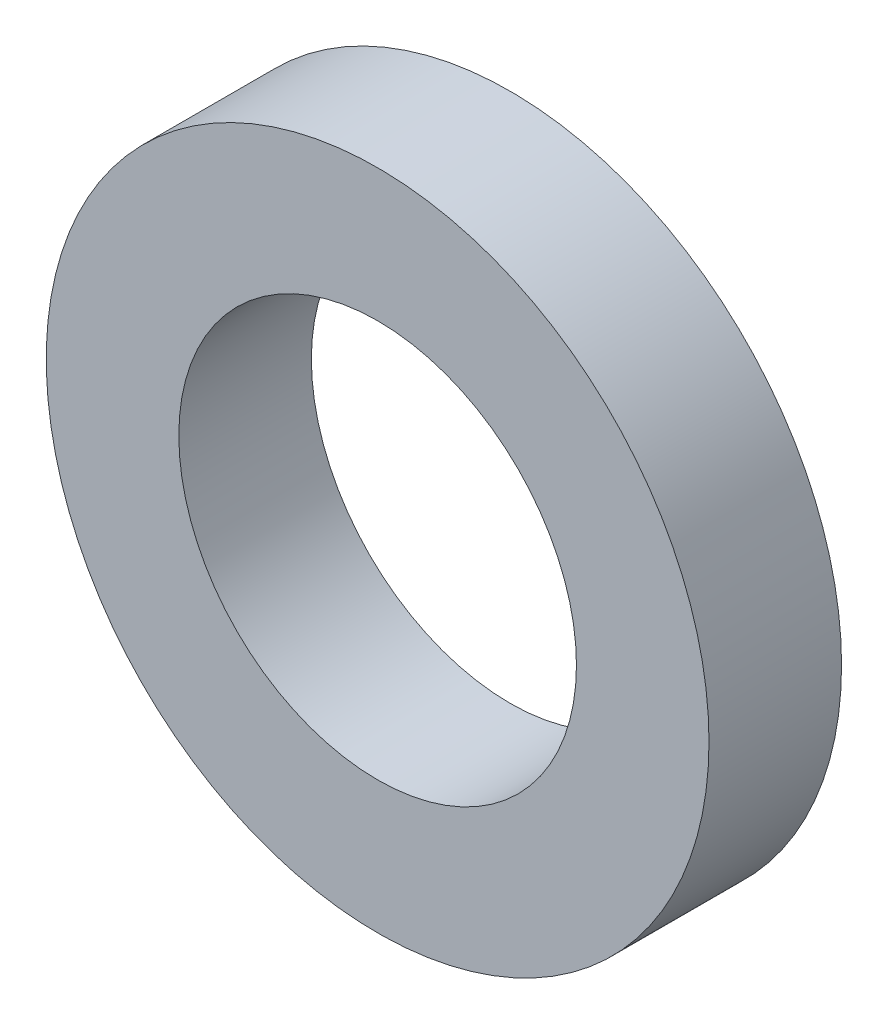
ISO-10303-21;
HEADER;
FILE_DESCRIPTION(('STEP AP214'),'2;1');
FILE_NAME('part.step','',(''),(''),'','','');
FILE_SCHEMA(('AUTOMOTIVE_DESIGN { 1 0 10303 214 1 1 1 1 }'));
ENDSEC;
DATA;
#1=APPLICATION_CONTEXT('core data for automotive mechanical design processes');
#2=APPLICATION_PROTOCOL_DEFINITION('international standard','automotive_design',2000,#1);
#3=PRODUCT_CONTEXT('',#1,'mechanical');
#4=PRODUCT('Part','Part','',(#3));
#5=PRODUCT_RELATED_PRODUCT_CATEGORY('part','',(#4));
#6=PRODUCT_DEFINITION_FORMATION('','',#4);
#7=PRODUCT_DEFINITION_CONTEXT('part definition',#1,'design');
#8=PRODUCT_DEFINITION('design','',#6,#7);
#9=PRODUCT_DEFINITION_SHAPE('','',#8);
#10=(LENGTH_UNIT() NAMED_UNIT(*) SI_UNIT(.MILLI.,.METRE.));
#11=(NAMED_UNIT(*) PLANE_ANGLE_UNIT() SI_UNIT($,.RADIAN.));
#12=(NAMED_UNIT(*) SI_UNIT($,.STERADIAN.) SOLID_ANGLE_UNIT());
#13=UNCERTAINTY_MEASURE_WITH_UNIT(LENGTH_MEASURE(1.E-05),#10,'distance_accuracy_value','');
#14=(GEOMETRIC_REPRESENTATION_CONTEXT(3) GLOBAL_UNCERTAINTY_ASSIGNED_CONTEXT((#13)) GLOBAL_UNIT_ASSIGNED_CONTEXT((#10,
#11,#12)) REPRESENTATION_CONTEXT('',''));
#15=CARTESIAN_POINT('',(0.,0.,0.));
#16=DIRECTION('',(0.,0.,1.));
#17=DIRECTION('',(1.,0.,0.));
#18=AXIS2_PLACEMENT_3D('',#15,#16,#17);
#19=CARTESIAN_POINT('',(0.,0.,10.));
#20=DIRECTION('',(0.,0.,1.));
#21=DIRECTION('',(1.,0.,0.));
#22=AXIS2_PLACEMENT_3D('',#19,#20,#21);
#23=PLANE('',#22);
#24=CARTESIAN_POINT('',(0.,0.,10.));
#25=DIRECTION('',(0.,0.,1.));
#26=DIRECTION('',(1.,0.,0.));
#27=AXIS2_PLACEMENT_3D('',#24,#25,#26);
#28=CIRCLE('',#27,25.);
#29=CARTESIAN_POINT('',(25.,0.,10.));
#30=VERTEX_POINT('',#29);
#31=EDGE_CURVE('E10',#30,#30,#28,.T.);
#32=ORIENTED_EDGE('',*,*,#31,.T.);
#33=EDGE_LOOP('',(#32));
#34=FACE_BOUND('',#33,.T.);
#35=CARTESIAN_POINT('',(0.,0.,10.));
#36=DIRECTION('',(0.,0.,1.));
#37=DIRECTION('',(1.,0.,0.));
#38=AXIS2_PLACEMENT_3D('',#35,#36,#37);
#39=CIRCLE('',#38,15.);
#40=CARTESIAN_POINT('',(15.,0.,10.));
#41=VERTEX_POINT('',#40);
#42=EDGE_CURVE('E42',#41,#41,#39,.T.);
#43=ORIENTED_EDGE('',*,*,#42,.F.);
#44=EDGE_LOOP('',(#43));
#45=FACE_BOUND('',#44,.T.);
#46=ADVANCED_FACE('F31',(#34,#45),#23,.T.);
#47=CARTESIAN_POINT('',(0.,0.,0.));
#48=DIRECTION('',(0.,0.,1.));
#49=DIRECTION('',(1.,0.,0.));
#50=AXIS2_PLACEMENT_3D('',#47,#48,#49);
#51=PLANE('',#50);
#52=CARTESIAN_POINT('',(0.,0.,0.));
#53=DIRECTION('',(0.,0.,1.));
#54=DIRECTION('',(1.,0.,0.));
#55=AXIS2_PLACEMENT_3D('',#52,#53,#54);
#56=CIRCLE('',#55,25.);
#57=CARTESIAN_POINT('',(25.,0.,0.));
#58=VERTEX_POINT('',#57);
#59=EDGE_CURVE('E35',#58,#58,#56,.T.);
#60=ORIENTED_EDGE('',*,*,#59,.F.);
#61=EDGE_LOOP('',(#60));
#62=FACE_BOUND('',#61,.T.);
#63=CARTESIAN_POINT('',(0.,0.,0.));
#64=DIRECTION('',(0.,0.,1.));
#65=DIRECTION('',(1.,0.,0.));
#66=AXIS2_PLACEMENT_3D('',#63,#64,#65);
#67=CIRCLE('',#66,15.);
#68=CARTESIAN_POINT('',(15.,0.,0.));
#69=VERTEX_POINT('',#68);
#70=EDGE_CURVE('E44',#69,#69,#67,.T.);
#71=ORIENTED_EDGE('',*,*,#70,.T.);
#72=EDGE_LOOP('',(#71));
#73=FACE_BOUND('',#72,.T.);
#74=ADVANCED_FACE('F54',(#62,#73),#51,.F.);
#75=CARTESIAN_POINT('',(0.,0.,10.));
#76=DIRECTION('',(0.,0.,-1.));
#77=DIRECTION('',(-1.,0.,0.));
#78=AXIS2_PLACEMENT_3D('',#75,#76,#77);
#79=CYLINDRICAL_SURFACE('',#78,25.);
#80=ORIENTED_EDGE('',*,*,#31,.F.);
#81=EDGE_LOOP('',(#80));
#82=FACE_BOUND('',#81,.T.);
#83=ORIENTED_EDGE('',*,*,#59,.T.);
#84=EDGE_LOOP('',(#83));
#85=FACE_BOUND('',#84,.T.);
#86=ADVANCED_FACE('F33',(#82,#85),#79,.T.);
#87=CARTESIAN_POINT('',(0.,0.,10.));
#88=DIRECTION('',(0.,0.,-1.));
#89=DIRECTION('',(-1.,0.,0.));
#90=AXIS2_PLACEMENT_3D('',#87,#88,#89);
#91=CYLINDRICAL_SURFACE('',#90,15.);
#92=ORIENTED_EDGE('',*,*,#42,.T.);
#93=EDGE_LOOP('',(#92));
#94=FACE_BOUND('',#93,.T.);
#95=ORIENTED_EDGE('',*,*,#70,.F.);
#96=EDGE_LOOP('',(#95));
#97=FACE_BOUND('',#96,.T.);
#98=ADVANCED_FACE('F50',(#94,#97),#91,.F.);
#99=CLOSED_SHELL('',(#46,#74,#86,#98));
#100=MANIFOLD_SOLID_BREP('B2',#99);
#101=ADVANCED_BREP_SHAPE_REPRESENTATION('',(#18,#100),#14);
#102=SHAPE_DEFINITION_REPRESENTATION(#9,#101);
ENDSEC;
END-ISO-10303-21;
